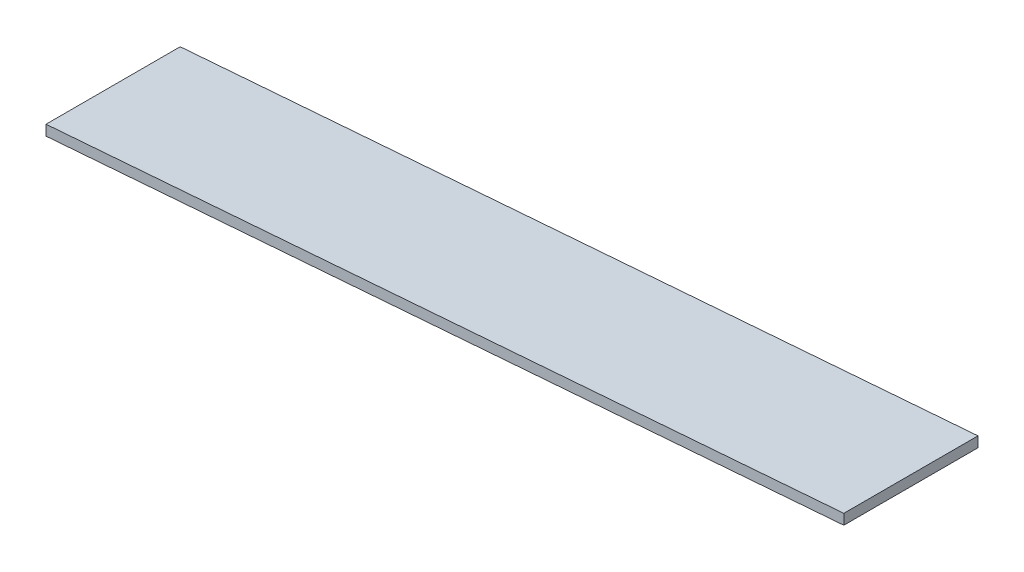
ISO-10303-21;
HEADER;
FILE_DESCRIPTION(('STEP AP214'),'2;1');
FILE_NAME('part.step','',(''),(''),'','','');
FILE_SCHEMA(('AUTOMOTIVE_DESIGN { 1 0 10303 214 1 1 1 1 }'));
ENDSEC;
DATA;
#1=APPLICATION_CONTEXT('core data for automotive mechanical design processes');
#2=APPLICATION_PROTOCOL_DEFINITION('international standard','automotive_design',2000,#1);
#3=PRODUCT_CONTEXT('',#1,'mechanical');
#4=PRODUCT('Part','Part','',(#3));
#5=PRODUCT_RELATED_PRODUCT_CATEGORY('part','',(#4));
#6=PRODUCT_DEFINITION_FORMATION('','',#4);
#7=PRODUCT_DEFINITION_CONTEXT('part definition',#1,'design');
#8=PRODUCT_DEFINITION('design','',#6,#7);
#9=PRODUCT_DEFINITION_SHAPE('','',#8);
#10=(LENGTH_UNIT() NAMED_UNIT(*) SI_UNIT(.MILLI.,.METRE.));
#11=(NAMED_UNIT(*) PLANE_ANGLE_UNIT() SI_UNIT($,.RADIAN.));
#12=(NAMED_UNIT(*) SI_UNIT($,.STERADIAN.) SOLID_ANGLE_UNIT());
#13=UNCERTAINTY_MEASURE_WITH_UNIT(LENGTH_MEASURE(1.E-05),#10,'distance_accuracy_value','');
#14=(GEOMETRIC_REPRESENTATION_CONTEXT(3) GLOBAL_UNCERTAINTY_ASSIGNED_CONTEXT((#13)) GLOBAL_UNIT_ASSIGNED_CONTEXT((#10,
#11,#12)) REPRESENTATION_CONTEXT('',''));
#15=CARTESIAN_POINT('',(0.,0.,0.));
#16=DIRECTION('',(0.,0.,1.));
#17=DIRECTION('',(1.,0.,0.));
#18=AXIS2_PLACEMENT_3D('',#15,#16,#17);
#19=CARTESIAN_POINT('',(0.,0.,6.5));
#20=DIRECTION('',(-1.,0.,0.));
#21=DIRECTION('',(0.,-1.,0.));
#22=AXIS2_PLACEMENT_3D('',#19,#20,#21);
#23=PLANE('',#22);
#24=DIRECTION('',(0.,1.,0.));
#25=VECTOR('',#24,1.);
#26=CARTESIAN_POINT('',(0.,0.,-6.5));
#27=LINE('',#26,#25);
#28=CARTESIAN_POINT('',(0.,0.,-6.5));
#29=VERTEX_POINT('',#28);
#30=CARTESIAN_POINT('',(0.,1.00301008414524,-6.5));
#31=VERTEX_POINT('',#30);
#32=EDGE_CURVE('E98',#29,#31,#27,.T.);
#33=ORIENTED_EDGE('',*,*,#32,.F.);
#34=DIRECTION('',(0.,0.,-1.));
#35=VECTOR('',#34,1.);
#36=CARTESIAN_POINT('',(0.,0.,6.5));
#37=LINE('',#36,#35);
#38=CARTESIAN_POINT('',(0.,0.,6.5));
#39=VERTEX_POINT('',#38);
#40=EDGE_CURVE('E11',#39,#29,#37,.T.);
#41=ORIENTED_EDGE('',*,*,#40,.F.);
#42=DIRECTION('',(0.,1.,0.));
#43=VECTOR('',#42,1.);
#44=CARTESIAN_POINT('',(0.,0.,6.5));
#45=LINE('',#44,#43);
#46=CARTESIAN_POINT('',(0.,1.00301008414524,6.5));
#47=VERTEX_POINT('',#46);
#48=EDGE_CURVE('E93',#39,#47,#45,.T.);
#49=ORIENTED_EDGE('',*,*,#48,.T.);
#50=DIRECTION('',(0.,0.,-1.));
#51=VECTOR('',#50,1.);
#52=CARTESIAN_POINT('',(0.,1.00301008414524,6.5));
#53=LINE('',#52,#51);
#54=EDGE_CURVE('E36',#47,#31,#53,.T.);
#55=ORIENTED_EDGE('',*,*,#54,.T.);
#56=EDGE_LOOP('',(#33,#41,#49,#55));
#57=FACE_BOUND('',#56,.T.);
#58=ADVANCED_FACE('F33',(#57),#23,.T.);
#59=CARTESIAN_POINT('',(0.,0.,6.5));
#60=DIRECTION('',(-0.0774150835080124,0.996998949269982,0.));
#61=DIRECTION('',(-0.996998949269982,-0.0774150835080124,0.));
#62=AXIS2_PLACEMENT_3D('',#59,#60,#61);
#63=PLANE('',#62);
#64=DIRECTION('',(0.996998949269982,0.0774150835080124,0.));
#65=VECTOR('',#64,1.);
#66=CARTESIAN_POINT('',(0.,0.,-6.5));
#67=LINE('',#66,#65);
#68=CARTESIAN_POINT('',(77.3,6.00219885843518,-6.5));
#69=VERTEX_POINT('',#68);
#70=EDGE_CURVE('E66',#29,#69,#67,.T.);
#71=ORIENTED_EDGE('',*,*,#70,.T.);
#72=DIRECTION('',(0.,0.,-1.));
#73=VECTOR('',#72,1.);
#74=CARTESIAN_POINT('',(77.3,6.00219885843518,6.5));
#75=LINE('',#74,#73);
#76=CARTESIAN_POINT('',(77.3,6.00219885843518,6.5));
#77=VERTEX_POINT('',#76);
#78=EDGE_CURVE('E42',#77,#69,#75,.T.);
#79=ORIENTED_EDGE('',*,*,#78,.F.);
#80=DIRECTION('',(0.996998949269982,0.0774150835080124,0.));
#81=VECTOR('',#80,1.);
#82=CARTESIAN_POINT('',(0.,0.,6.5));
#83=LINE('',#82,#81);
#84=EDGE_CURVE('E83',#39,#77,#83,.T.);
#85=ORIENTED_EDGE('',*,*,#84,.F.);
#86=ORIENTED_EDGE('',*,*,#40,.T.);
#87=EDGE_LOOP('',(#71,#79,#85,#86));
#88=FACE_BOUND('',#87,.T.);
#89=ADVANCED_FACE('F108',(#88),#63,.F.);
#90=CARTESIAN_POINT('',(77.3,6.00219885843518,6.5));
#91=DIRECTION('',(-1.,0.,0.));
#92=DIRECTION('',(0.,0.,1.));
#93=AXIS2_PLACEMENT_3D('',#90,#91,#92);
#94=PLANE('',#93);
#95=DIRECTION('',(0.,1.,0.));
#96=VECTOR('',#95,1.);
#97=CARTESIAN_POINT('',(77.3,6.00219885843518,-6.5));
#98=LINE('',#97,#96);
#99=CARTESIAN_POINT('',(77.3,7.00520894258042,-6.5));
#100=VERTEX_POINT('',#99);
#101=EDGE_CURVE('E90',#69,#100,#98,.T.);
#102=ORIENTED_EDGE('',*,*,#101,.T.);
#103=DIRECTION('',(0.,0.,-1.));
#104=VECTOR('',#103,1.);
#105=CARTESIAN_POINT('',(77.3,7.00520894258042,6.5));
#106=LINE('',#105,#104);
#107=CARTESIAN_POINT('',(77.3,7.00520894258042,6.5));
#108=VERTEX_POINT('',#107);
#109=EDGE_CURVE('E87',#108,#100,#106,.T.);
#110=ORIENTED_EDGE('',*,*,#109,.F.);
#111=DIRECTION('',(0.,1.,0.));
#112=VECTOR('',#111,1.);
#113=CARTESIAN_POINT('',(77.3,6.00219885843518,6.5));
#114=LINE('',#113,#112);
#115=EDGE_CURVE('E78',#77,#108,#114,.T.);
#116=ORIENTED_EDGE('',*,*,#115,.F.);
#117=ORIENTED_EDGE('',*,*,#78,.T.);
#118=EDGE_LOOP('',(#102,#110,#116,#117));
#119=FACE_BOUND('',#118,.T.);
#120=ADVANCED_FACE('F88',(#119),#94,.F.);
#121=CARTESIAN_POINT('',(0.,1.00301008414524,6.5));
#122=DIRECTION('',(-0.0774150835080124,0.996998949269982,0.));
#123=DIRECTION('',(-0.996998949269982,-0.0774150835080124,0.));
#124=AXIS2_PLACEMENT_3D('',#121,#122,#123);
#125=PLANE('',#124);
#126=DIRECTION('',(0.996998949269982,0.0774150835080125,0.));
#127=VECTOR('',#126,1.);
#128=CARTESIAN_POINT('',(0.,1.00301008414524,-6.5));
#129=LINE('',#128,#127);
#130=EDGE_CURVE('E101',#31,#100,#129,.T.);
#131=ORIENTED_EDGE('',*,*,#130,.F.);
#132=ORIENTED_EDGE('',*,*,#54,.F.);
#133=DIRECTION('',(0.996998949269982,0.0774150835080125,0.));
#134=VECTOR('',#133,1.);
#135=CARTESIAN_POINT('',(0.,1.00301008414524,6.5));
#136=LINE('',#135,#134);
#137=EDGE_CURVE('E82',#47,#108,#136,.T.);
#138=ORIENTED_EDGE('',*,*,#137,.T.);
#139=ORIENTED_EDGE('',*,*,#109,.T.);
#140=EDGE_LOOP('',(#131,#132,#138,#139));
#141=FACE_BOUND('',#140,.T.);
#142=ADVANCED_FACE('F92',(#141),#125,.T.);
#143=CARTESIAN_POINT('',(0.,0.,6.5));
#144=DIRECTION('',(0.,0.,-1.));
#145=DIRECTION('',(-1.,0.,0.));
#146=AXIS2_PLACEMENT_3D('',#143,#144,#145);
#147=PLANE('',#146);
#148=ORIENTED_EDGE('',*,*,#48,.F.);
#149=ORIENTED_EDGE('',*,*,#84,.T.);
#150=ORIENTED_EDGE('',*,*,#115,.T.);
#151=ORIENTED_EDGE('',*,*,#137,.F.);
#152=EDGE_LOOP('',(#148,#149,#150,#151));
#153=FACE_BOUND('',#152,.T.);
#154=ADVANCED_FACE('F81',(#153),#147,.F.);
#155=CARTESIAN_POINT('',(0.,0.,-6.5));
#156=DIRECTION('',(0.,0.,-1.));
#157=DIRECTION('',(-1.,0.,0.));
#158=AXIS2_PLACEMENT_3D('',#155,#156,#157);
#159=PLANE('',#158);
#160=ORIENTED_EDGE('',*,*,#32,.T.);
#161=ORIENTED_EDGE('',*,*,#130,.T.);
#162=ORIENTED_EDGE('',*,*,#101,.F.);
#163=ORIENTED_EDGE('',*,*,#70,.F.);
#164=EDGE_LOOP('',(#160,#161,#162,#163));
#165=FACE_BOUND('',#164,.T.);
#166=ADVANCED_FACE('F106',(#165),#159,.T.);
#167=CLOSED_SHELL('',(#58,#89,#120,#142,#154,#166));
#168=MANIFOLD_SOLID_BREP('B2',#167);
#169=ADVANCED_BREP_SHAPE_REPRESENTATION('',(#18,#168),#14);
#170=SHAPE_DEFINITION_REPRESENTATION(#9,#169);
ENDSEC;
END-ISO-10303-21;
